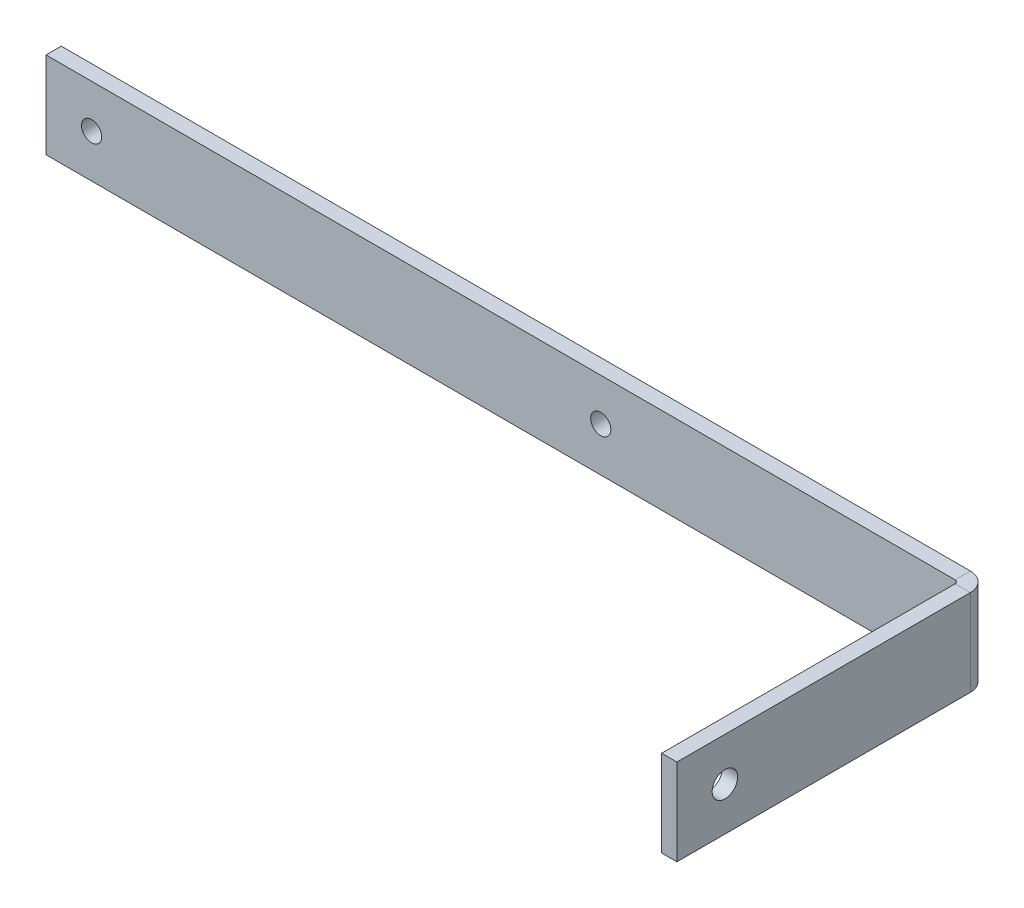
ISO-10303-21;
HEADER;
FILE_DESCRIPTION(('STEP AP214'),'2;1');
FILE_NAME('part.step','',(''),(''),'','','');
FILE_SCHEMA(('AUTOMOTIVE_DESIGN { 1 0 10303 214 1 1 1 1 }'));
ENDSEC;
DATA;
#1=APPLICATION_CONTEXT('core data for automotive mechanical design processes');
#2=APPLICATION_PROTOCOL_DEFINITION('international standard','automotive_design',2000,#1);
#3=PRODUCT_CONTEXT('',#1,'mechanical');
#4=PRODUCT('Part','Part','',(#3));
#5=PRODUCT_RELATED_PRODUCT_CATEGORY('part','',(#4));
#6=PRODUCT_DEFINITION_FORMATION('','',#4);
#7=PRODUCT_DEFINITION_CONTEXT('part definition',#1,'design');
#8=PRODUCT_DEFINITION('design','',#6,#7);
#9=PRODUCT_DEFINITION_SHAPE('','',#8);
#10=(LENGTH_UNIT() NAMED_UNIT(*) SI_UNIT(.MILLI.,.METRE.));
#11=(NAMED_UNIT(*) PLANE_ANGLE_UNIT() SI_UNIT($,.RADIAN.));
#12=(NAMED_UNIT(*) SI_UNIT($,.STERADIAN.) SOLID_ANGLE_UNIT());
#13=UNCERTAINTY_MEASURE_WITH_UNIT(LENGTH_MEASURE(1.E-05),#10,'distance_accuracy_value','');
#14=(GEOMETRIC_REPRESENTATION_CONTEXT(3) GLOBAL_UNCERTAINTY_ASSIGNED_CONTEXT((#13)) GLOBAL_UNIT_ASSIGNED_CONTEXT((#10,
#11,#12)) REPRESENTATION_CONTEXT('',''));
#15=CARTESIAN_POINT('',(0.,0.,0.));
#16=DIRECTION('',(0.,0.,1.));
#17=DIRECTION('',(1.,0.,0.));
#18=AXIS2_PLACEMENT_3D('',#15,#16,#17);
#19=CARTESIAN_POINT('',(0.,18.,-3.175));
#20=DIRECTION('',(0.,1.,0.));
#21=DIRECTION('',(0.,0.,1.));
#22=AXIS2_PLACEMENT_3D('',#19,#20,#21);
#23=PLANE('',#22);
#24=DIRECTION('',(-1.,0.,0.));
#25=VECTOR('',#24,1.);
#26=CARTESIAN_POINT('',(0.,18.,0.));
#27=LINE('',#26,#25);
#28=CARTESIAN_POINT('',(189.2634,18.,0.));
#29=VERTEX_POINT('',#28);
#30=CARTESIAN_POINT('',(0.,18.,0.));
#31=VERTEX_POINT('',#30);
#32=EDGE_CURVE('E91',#29,#31,#27,.T.);
#33=ORIENTED_EDGE('',*,*,#32,.F.);
#34=DIRECTION('',(0.,0.,-1.));
#35=VECTOR('',#34,1.);
#36=CARTESIAN_POINT('',(189.2634,18.,0.));
#37=LINE('',#36,#35);
#38=CARTESIAN_POINT('',(189.2634,18.,-3.175));
#39=VERTEX_POINT('',#38);
#40=EDGE_CURVE('E114',#29,#39,#37,.T.);
#41=ORIENTED_EDGE('',*,*,#40,.T.);
#42=DIRECTION('',(-1.,0.,0.));
#43=VECTOR('',#42,1.);
#44=CARTESIAN_POINT('',(0.,18.,-3.175));
#45=LINE('',#44,#43);
#46=CARTESIAN_POINT('',(0.,18.,-3.175));
#47=VERTEX_POINT('',#46);
#48=EDGE_CURVE('E76',#39,#47,#45,.T.);
#49=ORIENTED_EDGE('',*,*,#48,.T.);
#50=DIRECTION('',(0.,0.,1.));
#51=VECTOR('',#50,1.);
#52=CARTESIAN_POINT('',(0.,18.,-3.175));
#53=LINE('',#52,#51);
#54=EDGE_CURVE('E11',#47,#31,#53,.T.);
#55=ORIENTED_EDGE('',*,*,#54,.T.);
#56=EDGE_LOOP('',(#33,#41,#49,#55));
#57=FACE_BOUND('',#56,.T.);
#58=ADVANCED_FACE('F50',(#57),#23,.T.);
#59=CARTESIAN_POINT('',(0.,0.,-3.175));
#60=DIRECTION('',(0.,0.,-1.));
#61=DIRECTION('',(-1.,0.,0.));
#62=AXIS2_PLACEMENT_3D('',#59,#60,#61);
#63=PLANE('',#62);
#64=CARTESIAN_POINT('',(9.50000000000001,9.,-3.175));
#65=DIRECTION('',(0.,0.,1.));
#66=DIRECTION('',(1.,0.,0.));
#67=AXIS2_PLACEMENT_3D('',#64,#65,#66);
#68=CIRCLE('',#67,2.1);
#69=CARTESIAN_POINT('',(11.6,9.,-3.175));
#70=VERTEX_POINT('',#69);
#71=EDGE_CURVE('E209',#70,#70,#68,.T.);
#72=ORIENTED_EDGE('',*,*,#71,.T.);
#73=EDGE_LOOP('',(#72));
#74=FACE_BOUND('',#73,.T.);
#75=CARTESIAN_POINT('',(115.5,9.20203532607474,-3.175));
#76=DIRECTION('',(0.,0.,1.));
#77=DIRECTION('',(1.,0.,0.));
#78=AXIS2_PLACEMENT_3D('',#75,#76,#77);
#79=CIRCLE('',#78,2.1);
#80=CARTESIAN_POINT('',(117.6,9.20203532607474,-3.175));
#81=VERTEX_POINT('',#80);
#82=EDGE_CURVE('E195',#81,#81,#79,.T.);
#83=ORIENTED_EDGE('',*,*,#82,.T.);
#84=EDGE_LOOP('',(#83));
#85=FACE_BOUND('',#84,.T.);
#86=ORIENTED_EDGE('',*,*,#48,.F.);
#87=DIRECTION('',(0.,1.,0.));
#88=VECTOR('',#87,1.);
#89=CARTESIAN_POINT('',(189.2634,18.,-3.175));
#90=LINE('',#89,#88);
#91=CARTESIAN_POINT('',(189.2634,0.,-3.175));
#92=VERTEX_POINT('',#91);
#93=EDGE_CURVE('E149',#39,#92,#90,.F.);
#94=ORIENTED_EDGE('',*,*,#93,.T.);
#95=DIRECTION('',(1.,0.,0.));
#96=VECTOR('',#95,1.);
#97=CARTESIAN_POINT('',(0.,0.,-3.175));
#98=LINE('',#97,#96);
#99=CARTESIAN_POINT('',(0.,0.,-3.175));
#100=VERTEX_POINT('',#99);
#101=EDGE_CURVE('E121',#100,#92,#98,.T.);
#102=ORIENTED_EDGE('',*,*,#101,.F.);
#103=DIRECTION('',(0.,-1.,0.));
#104=VECTOR('',#103,1.);
#105=CARTESIAN_POINT('',(0.,0.,-3.175));
#106=LINE('',#105,#104);
#107=EDGE_CURVE('E100',#47,#100,#106,.T.);
#108=ORIENTED_EDGE('',*,*,#107,.F.);
#109=EDGE_LOOP('',(#86,#94,#102,#108));
#110=FACE_BOUND('',#109,.T.);
#111=ADVANCED_FACE('F290',(#74,#85,#110),#63,.T.);
#112=CARTESIAN_POINT('',(0.,0.,0.));
#113=DIRECTION('',(0.,0.,-1.));
#114=DIRECTION('',(-1.,0.,0.));
#115=AXIS2_PLACEMENT_3D('',#112,#113,#114);
#116=PLANE('',#115);
#117=CARTESIAN_POINT('',(9.50000000000001,9.,0.));
#118=DIRECTION('',(0.,0.,1.));
#119=DIRECTION('',(1.,0.,0.));
#120=AXIS2_PLACEMENT_3D('',#117,#118,#119);
#121=CIRCLE('',#120,2.09999999999999);
#122=CARTESIAN_POINT('',(11.6,9.,0.));
#123=VERTEX_POINT('',#122);
#124=EDGE_CURVE('E213',#123,#123,#121,.T.);
#125=ORIENTED_EDGE('',*,*,#124,.F.);
#126=EDGE_LOOP('',(#125));
#127=FACE_BOUND('',#126,.T.);
#128=CARTESIAN_POINT('',(115.5,9.20203532607474,0.));
#129=DIRECTION('',(0.,0.,1.));
#130=DIRECTION('',(1.,0.,0.));
#131=AXIS2_PLACEMENT_3D('',#128,#129,#130);
#132=CIRCLE('',#131,2.09999999999999);
#133=CARTESIAN_POINT('',(117.6,9.20203532607474,0.));
#134=VERTEX_POINT('',#133);
#135=EDGE_CURVE('E205',#134,#134,#132,.T.);
#136=ORIENTED_EDGE('',*,*,#135,.F.);
#137=EDGE_LOOP('',(#136));
#138=FACE_BOUND('',#137,.T.);
#139=DIRECTION('',(0.,1.,0.));
#140=VECTOR('',#139,1.);
#141=CARTESIAN_POINT('',(189.2634,18.,0.));
#142=LINE('',#141,#140);
#143=CARTESIAN_POINT('',(189.2634,0.,0.));
#144=VERTEX_POINT('',#143);
#145=EDGE_CURVE('E98',#29,#144,#142,.F.);
#146=ORIENTED_EDGE('',*,*,#145,.F.);
#147=ORIENTED_EDGE('',*,*,#32,.T.);
#148=DIRECTION('',(0.,-1.,0.));
#149=VECTOR('',#148,1.);
#150=CARTESIAN_POINT('',(0.,0.,0.));
#151=LINE('',#150,#149);
#152=CARTESIAN_POINT('',(0.,0.,0.));
#153=VERTEX_POINT('',#152);
#154=EDGE_CURVE('E95',#31,#153,#151,.T.);
#155=ORIENTED_EDGE('',*,*,#154,.T.);
#156=DIRECTION('',(1.,0.,0.));
#157=VECTOR('',#156,1.);
#158=CARTESIAN_POINT('',(0.,0.,0.));
#159=LINE('',#158,#157);
#160=EDGE_CURVE('E101',#153,#144,#159,.T.);
#161=ORIENTED_EDGE('',*,*,#160,.T.);
#162=EDGE_LOOP('',(#146,#147,#155,#161));
#163=FACE_BOUND('',#162,.T.);
#164=ADVANCED_FACE('F92',(#127,#138,#163),#116,.F.);
#165=CARTESIAN_POINT('',(0.,0.,-3.175));
#166=DIRECTION('',(-1.,0.,0.));
#167=DIRECTION('',(0.,-1.,0.));
#168=AXIS2_PLACEMENT_3D('',#165,#166,#167);
#169=PLANE('',#168);
#170=ORIENTED_EDGE('',*,*,#154,.F.);
#171=ORIENTED_EDGE('',*,*,#54,.F.);
#172=ORIENTED_EDGE('',*,*,#107,.T.);
#173=DIRECTION('',(0.,0.,1.));
#174=VECTOR('',#173,1.);
#175=CARTESIAN_POINT('',(0.,0.,-3.175));
#176=LINE('',#175,#174);
#177=EDGE_CURVE('E60',#100,#153,#176,.T.);
#178=ORIENTED_EDGE('',*,*,#177,.T.);
#179=EDGE_LOOP('',(#170,#171,#172,#178));
#180=FACE_BOUND('',#179,.T.);
#181=ADVANCED_FACE('F52',(#180),#169,.T.);
#182=CARTESIAN_POINT('',(0.,0.,-3.175));
#183=DIRECTION('',(0.,-1.,0.));
#184=DIRECTION('',(0.,0.,-1.));
#185=AXIS2_PLACEMENT_3D('',#182,#183,#184);
#186=PLANE('',#185);
#187=DIRECTION('',(0.,0.,-1.));
#188=VECTOR('',#187,1.);
#189=CARTESIAN_POINT('',(189.2634,0.,0.));
#190=LINE('',#189,#188);
#191=EDGE_CURVE('E108',#144,#92,#190,.T.);
#192=ORIENTED_EDGE('',*,*,#191,.F.);
#193=ORIENTED_EDGE('',*,*,#160,.F.);
#194=ORIENTED_EDGE('',*,*,#177,.F.);
#195=ORIENTED_EDGE('',*,*,#101,.T.);
#196=EDGE_LOOP('',(#192,#193,#194,#195));
#197=FACE_BOUND('',#196,.T.);
#198=ADVANCED_FACE('F281',(#197),#186,.T.);
#199=CARTESIAN_POINT('',(189.2634,0.,0.736600000000006));
#200=DIRECTION('',(0.,-1.,0.));
#201=DIRECTION('',(0.,0.,-1.));
#202=AXIS2_PLACEMENT_3D('',#199,#200,#201);
#203=PLANE('',#202);
#204=DIRECTION('',(1.,0.,0.));
#205=VECTOR('',#204,1.);
#206=CARTESIAN_POINT('',(190.,0.,0.736600000000004));
#207=LINE('',#206,#205);
#208=CARTESIAN_POINT('',(190.,0.,0.736600000000004));
#209=VERTEX_POINT('',#208);
#210=CARTESIAN_POINT('',(193.175,0.,0.736599999999992));
#211=VERTEX_POINT('',#210);
#212=EDGE_CURVE('E190',#209,#211,#207,.T.);
#213=ORIENTED_EDGE('',*,*,#212,.F.);
#214=CARTESIAN_POINT('',(189.2634,0.,0.736600000000006));
#215=DIRECTION('',(0.,1.,0.));
#216=DIRECTION('',(0.,0.,1.));
#217=AXIS2_PLACEMENT_3D('',#214,#215,#216);
#218=CIRCLE('',#217,0.736600000000004);
#219=EDGE_CURVE('E141',#144,#209,#218,.F.);
#220=ORIENTED_EDGE('',*,*,#219,.F.);
#221=ORIENTED_EDGE('',*,*,#191,.T.);
#222=CARTESIAN_POINT('',(189.2634,0.,0.736600000000006));
#223=DIRECTION('',(0.,1.,0.));
#224=DIRECTION('',(0.,0.,1.));
#225=AXIS2_PLACEMENT_3D('',#222,#223,#224);
#226=CIRCLE('',#225,3.9116);
#227=EDGE_CURVE('E68',#92,#211,#226,.F.);
#228=ORIENTED_EDGE('',*,*,#227,.T.);
#229=EDGE_LOOP('',(#213,#220,#221,#228));
#230=FACE_BOUND('',#229,.T.);
#231=ADVANCED_FACE('F280',(#230),#203,.T.);
#232=CARTESIAN_POINT('',(189.2634,18.,0.736600000000006));
#233=DIRECTION('',(0.,-1.,0.));
#234=DIRECTION('',(0.,0.,-1.));
#235=AXIS2_PLACEMENT_3D('',#232,#233,#234);
#236=PLANE('',#235);
#237=CARTESIAN_POINT('',(189.2634,18.,0.736600000000006));
#238=DIRECTION('',(0.,1.,0.));
#239=DIRECTION('',(0.,0.,1.));
#240=AXIS2_PLACEMENT_3D('',#237,#238,#239);
#241=CIRCLE('',#240,0.736600000000004);
#242=CARTESIAN_POINT('',(190.,18.,0.736600000000004));
#243=VERTEX_POINT('',#242);
#244=EDGE_CURVE('E134',#243,#29,#241,.T.);
#245=ORIENTED_EDGE('',*,*,#244,.F.);
#246=DIRECTION('',(1.,0.,0.));
#247=VECTOR('',#246,1.);
#248=CARTESIAN_POINT('',(190.,18.,0.736600000000004));
#249=LINE('',#248,#247);
#250=CARTESIAN_POINT('',(193.175,18.,0.736599999999993));
#251=VERTEX_POINT('',#250);
#252=EDGE_CURVE('E189',#243,#251,#249,.T.);
#253=ORIENTED_EDGE('',*,*,#252,.T.);
#254=CARTESIAN_POINT('',(189.2634,18.,0.736600000000006));
#255=DIRECTION('',(0.,1.,0.));
#256=DIRECTION('',(0.,0.,1.));
#257=AXIS2_PLACEMENT_3D('',#254,#255,#256);
#258=CIRCLE('',#257,3.9116);
#259=EDGE_CURVE('E145',#251,#39,#258,.T.);
#260=ORIENTED_EDGE('',*,*,#259,.T.);
#261=ORIENTED_EDGE('',*,*,#40,.F.);
#262=EDGE_LOOP('',(#245,#253,#260,#261));
#263=FACE_BOUND('',#262,.T.);
#264=ADVANCED_FACE('F274',(#263),#236,.F.);
#265=CARTESIAN_POINT('',(189.2634,18.,0.736600000000006));
#266=DIRECTION('',(0.,1.,0.));
#267=DIRECTION('',(1.,0.,0.));
#268=AXIS2_PLACEMENT_3D('',#265,#266,#267);
#269=CYLINDRICAL_SURFACE('',#268,3.9116);
#270=ORIENTED_EDGE('',*,*,#93,.F.);
#271=ORIENTED_EDGE('',*,*,#259,.F.);
#272=DIRECTION('',(0.,-1.,0.));
#273=VECTOR('',#272,1.);
#274=CARTESIAN_POINT('',(193.175,0.,0.736599999999993));
#275=LINE('',#274,#273);
#276=EDGE_CURVE('E176',#251,#211,#275,.T.);
#277=ORIENTED_EDGE('',*,*,#276,.T.);
#278=ORIENTED_EDGE('',*,*,#227,.F.);
#279=EDGE_LOOP('',(#270,#271,#277,#278));
#280=FACE_BOUND('',#279,.T.);
#281=ADVANCED_FACE('F301',(#280),#269,.T.);
#282=CARTESIAN_POINT('',(189.2634,18.,0.736600000000006));
#283=DIRECTION('',(0.,1.,0.));
#284=DIRECTION('',(1.,0.,0.));
#285=AXIS2_PLACEMENT_3D('',#282,#283,#284);
#286=CYLINDRICAL_SURFACE('',#285,0.736600000000004);
#287=ORIENTED_EDGE('',*,*,#145,.T.);
#288=ORIENTED_EDGE('',*,*,#219,.T.);
#289=DIRECTION('',(0.,1.,0.));
#290=VECTOR('',#289,1.);
#291=CARTESIAN_POINT('',(190.,0.,0.736600000000004));
#292=LINE('',#291,#290);
#293=EDGE_CURVE('E194',#209,#243,#292,.T.);
#294=ORIENTED_EDGE('',*,*,#293,.T.);
#295=ORIENTED_EDGE('',*,*,#244,.T.);
#296=EDGE_LOOP('',(#287,#288,#294,#295));
#297=FACE_BOUND('',#296,.T.);
#298=ADVANCED_FACE('F277',(#297),#286,.F.);
#299=CARTESIAN_POINT('',(193.175,18.,61.825));
#300=DIRECTION('',(0.,-1.,0.));
#301=DIRECTION('',(0.,0.,-1.));
#302=AXIS2_PLACEMENT_3D('',#299,#300,#301);
#303=PLANE('',#302);
#304=ORIENTED_EDGE('',*,*,#252,.F.);
#305=DIRECTION('',(0.,0.,1.));
#306=VECTOR('',#305,1.);
#307=CARTESIAN_POINT('',(190.,18.,61.825));
#308=LINE('',#307,#306);
#309=CARTESIAN_POINT('',(190.,18.,61.825));
#310=VERTEX_POINT('',#309);
#311=EDGE_CURVE('E172',#243,#310,#308,.T.);
#312=ORIENTED_EDGE('',*,*,#311,.T.);
#313=DIRECTION('',(-1.,0.,0.));
#314=VECTOR('',#313,1.);
#315=CARTESIAN_POINT('',(193.175,18.,61.825));
#316=LINE('',#315,#314);
#317=CARTESIAN_POINT('',(193.175,18.,61.825));
#318=VERTEX_POINT('',#317);
#319=EDGE_CURVE('E138',#318,#310,#316,.T.);
#320=ORIENTED_EDGE('',*,*,#319,.F.);
#321=DIRECTION('',(0.,0.,1.));
#322=VECTOR('',#321,1.);
#323=CARTESIAN_POINT('',(193.175,18.,61.825));
#324=LINE('',#323,#322);
#325=EDGE_CURVE('E167',#251,#318,#324,.T.);
#326=ORIENTED_EDGE('',*,*,#325,.F.);
#327=EDGE_LOOP('',(#304,#312,#320,#326));
#328=FACE_BOUND('',#327,.T.);
#329=ADVANCED_FACE('F246',(#328),#303,.F.);
#330=CARTESIAN_POINT('',(193.175,0.,0.));
#331=DIRECTION('',(0.,1.,0.));
#332=DIRECTION('',(0.,0.,1.));
#333=AXIS2_PLACEMENT_3D('',#330,#331,#332);
#334=PLANE('',#333);
#335=ORIENTED_EDGE('',*,*,#212,.T.);
#336=DIRECTION('',(0.,0.,-1.));
#337=VECTOR('',#336,1.);
#338=CARTESIAN_POINT('',(193.175,0.,0.));
#339=LINE('',#338,#337);
#340=CARTESIAN_POINT('',(193.175,0.,61.825));
#341=VERTEX_POINT('',#340);
#342=EDGE_CURVE('E162',#341,#211,#339,.T.);
#343=ORIENTED_EDGE('',*,*,#342,.F.);
#344=DIRECTION('',(-1.,0.,0.));
#345=VECTOR('',#344,1.);
#346=CARTESIAN_POINT('',(193.175,0.,61.825));
#347=LINE('',#346,#345);
#348=CARTESIAN_POINT('',(190.,0.,61.825));
#349=VERTEX_POINT('',#348);
#350=EDGE_CURVE('E158',#341,#349,#347,.T.);
#351=ORIENTED_EDGE('',*,*,#350,.T.);
#352=DIRECTION('',(0.,0.,-1.));
#353=VECTOR('',#352,1.);
#354=CARTESIAN_POINT('',(190.,0.,0.));
#355=LINE('',#354,#353);
#356=EDGE_CURVE('E163',#349,#209,#355,.T.);
#357=ORIENTED_EDGE('',*,*,#356,.T.);
#358=EDGE_LOOP('',(#335,#343,#351,#357));
#359=FACE_BOUND('',#358,.T.);
#360=ADVANCED_FACE('F309',(#359),#334,.F.);
#361=CARTESIAN_POINT('',(193.175,0.,-6.93470814120312E-13));
#362=DIRECTION('',(-1.,0.,0.));
#363=DIRECTION('',(0.,0.,1.));
#364=AXIS2_PLACEMENT_3D('',#361,#362,#363);
#365=PLANE('',#364);
#366=CARTESIAN_POINT('',(193.175,9.,51.825));
#367=DIRECTION('',(1.,0.,0.));
#368=DIRECTION('',(0.,0.,-1.));
#369=AXIS2_PLACEMENT_3D('',#366,#367,#368);
#370=CIRCLE('',#369,2.65);
#371=CARTESIAN_POINT('',(193.175,9.,49.175));
#372=VERTEX_POINT('',#371);
#373=EDGE_CURVE('E217',#372,#372,#370,.T.);
#374=ORIENTED_EDGE('',*,*,#373,.F.);
#375=EDGE_LOOP('',(#374));
#376=FACE_BOUND('',#375,.T.);
#377=ORIENTED_EDGE('',*,*,#276,.F.);
#378=ORIENTED_EDGE('',*,*,#325,.T.);
#379=DIRECTION('',(0.,-1.,0.));
#380=VECTOR('',#379,1.);
#381=CARTESIAN_POINT('',(193.175,0.,61.825));
#382=LINE('',#381,#380);
#383=EDGE_CURVE('E180',#318,#341,#382,.T.);
#384=ORIENTED_EDGE('',*,*,#383,.T.);
#385=ORIENTED_EDGE('',*,*,#342,.T.);
#386=EDGE_LOOP('',(#377,#378,#384,#385));
#387=FACE_BOUND('',#386,.T.);
#388=ADVANCED_FACE('F234',(#376,#387),#365,.F.);
#389=CARTESIAN_POINT('',(190.,0.,-6.82385360869485E-13));
#390=DIRECTION('',(-1.,0.,0.));
#391=DIRECTION('',(0.,0.,1.));
#392=AXIS2_PLACEMENT_3D('',#389,#390,#391);
#393=PLANE('',#392);
#394=CARTESIAN_POINT('',(190.,9.,51.825));
#395=DIRECTION('',(-1.,0.,0.));
#396=DIRECTION('',(0.,0.,1.));
#397=AXIS2_PLACEMENT_3D('',#394,#395,#396);
#398=CIRCLE('',#397,2.65);
#399=CARTESIAN_POINT('',(190.,9.,54.475));
#400=VERTEX_POINT('',#399);
#401=EDGE_CURVE('E54',#400,#400,#398,.T.);
#402=ORIENTED_EDGE('',*,*,#401,.F.);
#403=EDGE_LOOP('',(#402));
#404=FACE_BOUND('',#403,.T.);
#405=ORIENTED_EDGE('',*,*,#311,.F.);
#406=ORIENTED_EDGE('',*,*,#293,.F.);
#407=ORIENTED_EDGE('',*,*,#356,.F.);
#408=DIRECTION('',(0.,-1.,0.));
#409=VECTOR('',#408,1.);
#410=CARTESIAN_POINT('',(190.,0.,61.825));
#411=LINE('',#410,#409);
#412=EDGE_CURVE('E168',#310,#349,#411,.T.);
#413=ORIENTED_EDGE('',*,*,#412,.F.);
#414=EDGE_LOOP('',(#405,#406,#407,#413));
#415=FACE_BOUND('',#414,.T.);
#416=ADVANCED_FACE('F230',(#404,#415),#393,.T.);
#417=CARTESIAN_POINT('',(193.175,0.,61.825));
#418=DIRECTION('',(0.,0.,-1.));
#419=DIRECTION('',(-1.,0.,0.));
#420=AXIS2_PLACEMENT_3D('',#417,#418,#419);
#421=PLANE('',#420);
#422=ORIENTED_EDGE('',*,*,#412,.T.);
#423=ORIENTED_EDGE('',*,*,#350,.F.);
#424=ORIENTED_EDGE('',*,*,#383,.F.);
#425=ORIENTED_EDGE('',*,*,#319,.T.);
#426=EDGE_LOOP('',(#422,#423,#424,#425));
#427=FACE_BOUND('',#426,.T.);
#428=ADVANCED_FACE('F233',(#427),#421,.F.);
#429=CARTESIAN_POINT('',(115.5,9.20203532607474,0.));
#430=DIRECTION('',(0.,0.,1.));
#431=DIRECTION('',(1.,0.,0.));
#432=AXIS2_PLACEMENT_3D('',#429,#430,#431);
#433=CYLINDRICAL_SURFACE('',#432,2.1);
#434=ORIENTED_EDGE('',*,*,#82,.F.);
#435=EDGE_LOOP('',(#434));
#436=FACE_BOUND('',#435,.T.);
#437=ORIENTED_EDGE('',*,*,#135,.T.);
#438=EDGE_LOOP('',(#437));
#439=FACE_BOUND('',#438,.T.);
#440=ADVANCED_FACE('F312',(#436,#439),#433,.F.);
#441=CARTESIAN_POINT('',(9.50000000000001,9.,0.));
#442=DIRECTION('',(0.,0.,1.));
#443=DIRECTION('',(1.,0.,0.));
#444=AXIS2_PLACEMENT_3D('',#441,#442,#443);
#445=CYLINDRICAL_SURFACE('',#444,2.09999999999999);
#446=ORIENTED_EDGE('',*,*,#71,.F.);
#447=EDGE_LOOP('',(#446));
#448=FACE_BOUND('',#447,.T.);
#449=ORIENTED_EDGE('',*,*,#124,.T.);
#450=EDGE_LOOP('',(#449));
#451=FACE_BOUND('',#450,.T.);
#452=ADVANCED_FACE('F321',(#448,#451),#445,.F.);
#453=CARTESIAN_POINT('',(0.,9.,51.8250000000008));
#454=DIRECTION('',(1.,0.,0.));
#455=DIRECTION('',(0.,0.,-1.));
#456=AXIS2_PLACEMENT_3D('',#453,#454,#455);
#457=CYLINDRICAL_SURFACE('',#456,2.65);
#458=ORIENTED_EDGE('',*,*,#401,.T.);
#459=EDGE_LOOP('',(#458));
#460=FACE_BOUND('',#459,.T.);
#461=ORIENTED_EDGE('',*,*,#373,.T.);
#462=EDGE_LOOP('',(#461));
#463=FACE_BOUND('',#462,.T.);
#464=ADVANCED_FACE('F228',(#460,#463),#457,.F.);
#465=CLOSED_SHELL('',(#58,#111,#164,#181,#198,#231,#264,#281,#298,#329,#360,#388,#416,#428,#440,
#452,#464));
#466=MANIFOLD_SOLID_BREP('B2',#465);
#467=ADVANCED_BREP_SHAPE_REPRESENTATION('',(#18,#466),#14);
#468=SHAPE_DEFINITION_REPRESENTATION(#9,#467);
ENDSEC;
END-ISO-10303-21;
